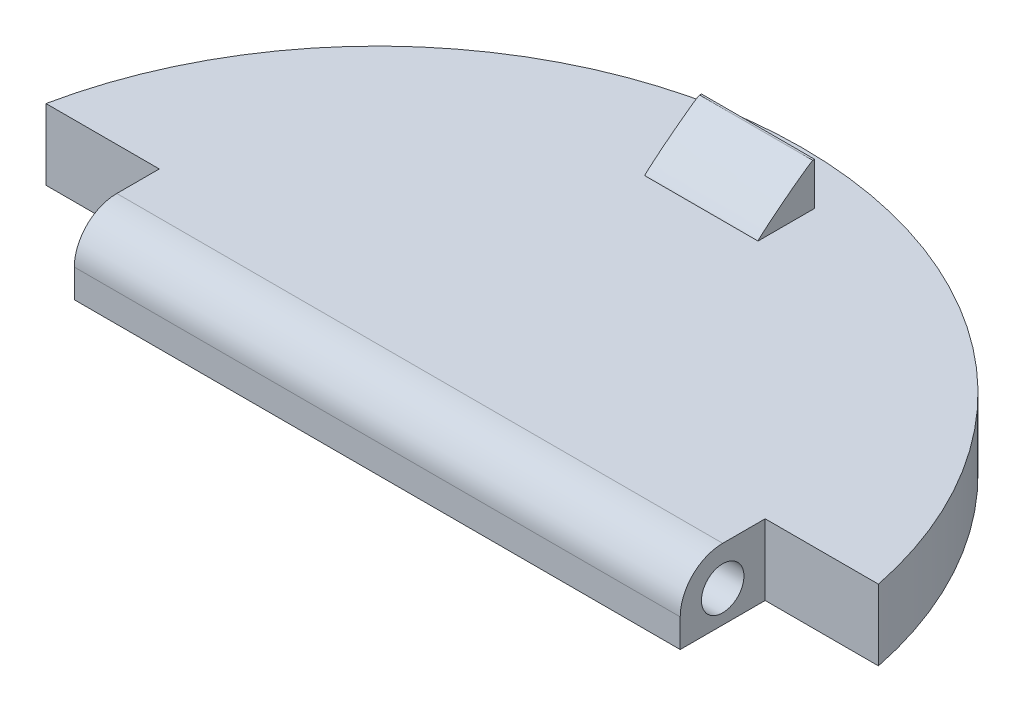
ISO-10303-21;
HEADER;
FILE_DESCRIPTION(('STEP AP214'),'2;1');
FILE_NAME('part.step','',(''),(''),'','','');
FILE_SCHEMA(('AUTOMOTIVE_DESIGN { 1 0 10303 214 1 1 1 1 }'));
ENDSEC;
DATA;
#1=APPLICATION_CONTEXT('core data for automotive mechanical design processes');
#2=APPLICATION_PROTOCOL_DEFINITION('international standard','automotive_design',2000,#1);
#3=PRODUCT_CONTEXT('',#1,'mechanical');
#4=PRODUCT('Part','Part','',(#3));
#5=PRODUCT_RELATED_PRODUCT_CATEGORY('part','',(#4));
#6=PRODUCT_DEFINITION_FORMATION('','',#4);
#7=PRODUCT_DEFINITION_CONTEXT('part definition',#1,'design');
#8=PRODUCT_DEFINITION('design','',#6,#7);
#9=PRODUCT_DEFINITION_SHAPE('','',#8);
#10=(LENGTH_UNIT() NAMED_UNIT(*) SI_UNIT(.MILLI.,.METRE.));
#11=(NAMED_UNIT(*) PLANE_ANGLE_UNIT() SI_UNIT($,.RADIAN.));
#12=(NAMED_UNIT(*) SI_UNIT($,.STERADIAN.) SOLID_ANGLE_UNIT());
#13=UNCERTAINTY_MEASURE_WITH_UNIT(LENGTH_MEASURE(1.E-05),#10,'distance_accuracy_value','');
#14=(GEOMETRIC_REPRESENTATION_CONTEXT(3) GLOBAL_UNCERTAINTY_ASSIGNED_CONTEXT((#13)) GLOBAL_UNIT_ASSIGNED_CONTEXT((#10,
#11,#12)) REPRESENTATION_CONTEXT('',''));
#15=CARTESIAN_POINT('',(0.,0.,0.));
#16=DIRECTION('',(0.,0.,1.));
#17=DIRECTION('',(1.,0.,0.));
#18=AXIS2_PLACEMENT_3D('',#15,#16,#17);
#19=CARTESIAN_POINT('',(0.,5.,0.));
#20=DIRECTION('',(0.,1.,0.));
#21=DIRECTION('',(0.,0.,1.));
#22=AXIS2_PLACEMENT_3D('',#19,#20,#21);
#23=PLANE('',#22);
#24=DIRECTION('',(0.,0.,-1.));
#25=VECTOR('',#24,1.);
#26=CARTESIAN_POINT('',(-21.3938769133982,5.,0.));
#27=LINE('',#26,#25);
#28=CARTESIAN_POINT('',(-21.3938769133982,5.,-3.));
#29=VERTEX_POINT('',#28);
#30=CARTESIAN_POINT('',(-21.3938769133982,5.,-6.));
#31=VERTEX_POINT('',#30);
#32=EDGE_CURVE('E125',#29,#31,#27,.T.);
#33=ORIENTED_EDGE('',*,*,#32,.F.);
#34=DIRECTION('',(1.,0.,0.));
#35=VECTOR('',#34,1.);
#36=CARTESIAN_POINT('',(21.3938769133982,5.,-3.));
#37=LINE('',#36,#35);
#38=CARTESIAN_POINT('',(21.3938769133982,5.,-3.));
#39=VERTEX_POINT('',#38);
#40=EDGE_CURVE('E241',#29,#39,#37,.T.);
#41=ORIENTED_EDGE('',*,*,#40,.T.);
#42=DIRECTION('',(0.,0.,1.));
#43=VECTOR('',#42,1.);
#44=CARTESIAN_POINT('',(21.3938769133982,5.,0.));
#45=LINE('',#44,#43);
#46=CARTESIAN_POINT('',(21.3938769133982,5.,-6.));
#47=VERTEX_POINT('',#46);
#48=EDGE_CURVE('E167',#47,#39,#45,.T.);
#49=ORIENTED_EDGE('',*,*,#48,.F.);
#50=DIRECTION('',(-1.,0.,0.));
#51=VECTOR('',#50,1.);
#52=CARTESIAN_POINT('',(21.3938769133982,5.,-6.));
#53=LINE('',#52,#51);
#54=CARTESIAN_POINT('',(29.3938769133982,5.,-6.));
#55=VERTEX_POINT('',#54);
#56=EDGE_CURVE('E163',#55,#47,#53,.T.);
#57=ORIENTED_EDGE('',*,*,#56,.F.);
#58=CARTESIAN_POINT('',(0.,5.,0.));
#59=DIRECTION('',(0.,1.,0.));
#60=DIRECTION('',(0.,0.,1.));
#61=AXIS2_PLACEMENT_3D('',#58,#59,#60);
#62=CIRCLE('',#61,30.);
#63=CARTESIAN_POINT('',(-29.3938769133982,5.,-6.));
#64=VERTEX_POINT('',#63);
#65=EDGE_CURVE('E153',#55,#64,#62,.T.);
#66=ORIENTED_EDGE('',*,*,#65,.T.);
#67=DIRECTION('',(-1.,0.,0.));
#68=VECTOR('',#67,1.);
#69=CARTESIAN_POINT('',(-21.3938769133982,5.,-6.));
#70=LINE('',#69,#68);
#71=EDGE_CURVE('E136',#31,#64,#70,.T.);
#72=ORIENTED_EDGE('',*,*,#71,.F.);
#73=EDGE_LOOP('',(#33,#41,#49,#57,#66,#72));
#74=FACE_BOUND('',#73,.T.);
#75=DIRECTION('',(-1.,0.,0.));
#76=VECTOR('',#75,1.);
#77=CARTESIAN_POINT('',(-3.84159331598207,5.,-26.7316665793187));
#78=LINE('',#77,#76);
#79=CARTESIAN_POINT('',(4.15840668401793,5.,-26.7316665793187));
#80=VERTEX_POINT('',#79);
#81=CARTESIAN_POINT('',(-3.84159331598207,5.,-26.7316665793187));
#82=VERTEX_POINT('',#81);
#83=EDGE_CURVE('E200',#80,#82,#78,.T.);
#84=ORIENTED_EDGE('',*,*,#83,.F.);
#85=DIRECTION('',(0.,0.,-1.));
#86=VECTOR('',#85,1.);
#87=CARTESIAN_POINT('',(4.15840668401793,5.,-26.7316665793187));
#88=LINE('',#87,#86);
#89=CARTESIAN_POINT('',(4.15840668401793,5.,-22.7316665793187));
#90=VERTEX_POINT('',#89);
#91=EDGE_CURVE('E161',#90,#80,#88,.T.);
#92=ORIENTED_EDGE('',*,*,#91,.F.);
#93=CARTESIAN_POINT('',(-4.24159331598207,5.,-22.7316665793187));
#94=CARTESIAN_POINT('',(-1.30825998264874,5.,-22.7316665793187));
#95=CARTESIAN_POINT('',(1.6250733506846,5.,-22.7316665793187));
#96=CARTESIAN_POINT('',(4.55840668401793,5.,-22.7316665793187));
#97=(BOUNDED_CURVE() B_SPLINE_CURVE(3,(#93,#94,#95,#96),.UNSPECIFIED.,.F.,
.F.) B_SPLINE_CURVE_WITH_KNOTS((4,4),(-0.00455840668401793,0.00424159331598207),
.UNSPECIFIED.) CURVE() GEOMETRIC_REPRESENTATION_ITEM() RATIONAL_B_SPLINE_CURVE((1.,1.,1.,1.)) REPRESENTATION_ITEM(''));
#98=CARTESIAN_POINT('',(-3.84159331598207,5.,-22.7316665793187));
#99=VERTEX_POINT('',#98);
#100=EDGE_CURVE('E188',#99,#90,#97,.T.);
#101=ORIENTED_EDGE('',*,*,#100,.F.);
#102=DIRECTION('',(0.,0.,1.));
#103=VECTOR('',#102,1.);
#104=CARTESIAN_POINT('',(-3.84159331598207,5.,-26.7316665793187));
#105=LINE('',#104,#103);
#106=EDGE_CURVE('E203',#82,#99,#105,.T.);
#107=ORIENTED_EDGE('',*,*,#106,.F.);
#108=EDGE_LOOP('',(#84,#92,#101,#107));
#109=FACE_BOUND('',#108,.T.);
#110=ADVANCED_FACE('F44',(#74,#109),#23,.T.);
#111=CARTESIAN_POINT('',(0.,5.,0.));
#112=DIRECTION('',(0.,-1.,0.));
#113=DIRECTION('',(0.,0.,-1.));
#114=AXIS2_PLACEMENT_3D('',#111,#112,#113);
#115=CYLINDRICAL_SURFACE('',#114,30.);
#116=CARTESIAN_POINT('',(0.,0.,0.));
#117=DIRECTION('',(0.,1.,0.));
#118=DIRECTION('',(0.,0.,1.));
#119=AXIS2_PLACEMENT_3D('',#116,#117,#118);
#120=CIRCLE('',#119,30.);
#121=CARTESIAN_POINT('',(29.3938769133982,0.,-6.));
#122=VERTEX_POINT('',#121);
#123=CARTESIAN_POINT('',(-29.3938769133982,0.,-6.));
#124=VERTEX_POINT('',#123);
#125=EDGE_CURVE('E210',#122,#124,#120,.T.);
#126=ORIENTED_EDGE('',*,*,#125,.T.);
#127=DIRECTION('',(0.,1.,0.));
#128=VECTOR('',#127,1.);
#129=CARTESIAN_POINT('',(-29.3938769133982,-5.,-6.));
#130=LINE('',#129,#128);
#131=EDGE_CURVE('E146',#124,#64,#130,.T.);
#132=ORIENTED_EDGE('',*,*,#131,.T.);
#133=ORIENTED_EDGE('',*,*,#65,.F.);
#134=DIRECTION('',(0.,1.,0.));
#135=VECTOR('',#134,1.);
#136=CARTESIAN_POINT('',(29.3938769133982,-5.,-6.));
#137=LINE('',#136,#135);
#138=EDGE_CURVE('E171',#122,#55,#137,.T.);
#139=ORIENTED_EDGE('',*,*,#138,.F.);
#140=EDGE_LOOP('',(#126,#132,#133,#139));
#141=FACE_BOUND('',#140,.T.);
#142=ADVANCED_FACE('F251',(#141),#115,.T.);
#143=CARTESIAN_POINT('',(-30.,5.,0.));
#144=DIRECTION('',(0.,0.,-1.));
#145=DIRECTION('',(-1.,0.,0.));
#146=AXIS2_PLACEMENT_3D('',#143,#144,#145);
#147=PLANE('',#146);
#148=DIRECTION('',(0.,1.,0.));
#149=VECTOR('',#148,1.);
#150=CARTESIAN_POINT('',(21.3938769133982,-5.,0.));
#151=LINE('',#150,#149);
#152=CARTESIAN_POINT('',(21.3938769133982,0.,0.));
#153=VERTEX_POINT('',#152);
#154=CARTESIAN_POINT('',(21.3938769133982,2.,0.));
#155=VERTEX_POINT('',#154);
#156=EDGE_CURVE('E137',#153,#155,#151,.T.);
#157=ORIENTED_EDGE('',*,*,#156,.T.);
#158=DIRECTION('',(1.,0.,0.));
#159=VECTOR('',#158,1.);
#160=CARTESIAN_POINT('',(-21.3938769133982,2.,0.));
#161=LINE('',#160,#159);
#162=CARTESIAN_POINT('',(-21.3938769133982,2.,0.));
#163=VERTEX_POINT('',#162);
#164=EDGE_CURVE('E52',#155,#163,#161,.F.);
#165=ORIENTED_EDGE('',*,*,#164,.T.);
#166=DIRECTION('',(0.,1.,0.));
#167=VECTOR('',#166,1.);
#168=CARTESIAN_POINT('',(-21.3938769133982,-5.,0.));
#169=LINE('',#168,#167);
#170=CARTESIAN_POINT('',(-21.3938769133982,0.,0.));
#171=VERTEX_POINT('',#170);
#172=EDGE_CURVE('E147',#171,#163,#169,.T.);
#173=ORIENTED_EDGE('',*,*,#172,.F.);
#174=DIRECTION('',(1.,0.,0.));
#175=VECTOR('',#174,1.);
#176=CARTESIAN_POINT('',(-30.,0.,0.));
#177=LINE('',#176,#175);
#178=EDGE_CURVE('E189',#171,#153,#177,.T.);
#179=ORIENTED_EDGE('',*,*,#178,.T.);
#180=EDGE_LOOP('',(#157,#165,#173,#179));
#181=FACE_BOUND('',#180,.T.);
#182=ADVANCED_FACE('F221',(#181),#147,.F.);
#183=CARTESIAN_POINT('',(0.,0.,0.));
#184=DIRECTION('',(0.,1.,0.));
#185=DIRECTION('',(0.,0.,1.));
#186=AXIS2_PLACEMENT_3D('',#183,#184,#185);
#187=PLANE('',#186);
#188=DIRECTION('',(0.,0.,-1.));
#189=VECTOR('',#188,1.);
#190=CARTESIAN_POINT('',(-21.3938769133982,0.,0.));
#191=LINE('',#190,#189);
#192=CARTESIAN_POINT('',(-21.3938769133982,0.,-6.));
#193=VERTEX_POINT('',#192);
#194=EDGE_CURVE('E225',#171,#193,#191,.T.);
#195=ORIENTED_EDGE('',*,*,#194,.T.);
#196=DIRECTION('',(-1.,0.,0.));
#197=VECTOR('',#196,1.);
#198=CARTESIAN_POINT('',(0.,0.,-6.));
#199=LINE('',#198,#197);
#200=EDGE_CURVE('E143',#193,#124,#199,.T.);
#201=ORIENTED_EDGE('',*,*,#200,.T.);
#202=ORIENTED_EDGE('',*,*,#125,.F.);
#203=DIRECTION('',(-1.,0.,0.));
#204=VECTOR('',#203,1.);
#205=CARTESIAN_POINT('',(0.,0.,-6.));
#206=LINE('',#205,#204);
#207=CARTESIAN_POINT('',(21.3938769133982,0.,-6.));
#208=VERTEX_POINT('',#207);
#209=EDGE_CURVE('E229',#122,#208,#206,.T.);
#210=ORIENTED_EDGE('',*,*,#209,.T.);
#211=DIRECTION('',(0.,0.,1.));
#212=VECTOR('',#211,1.);
#213=CARTESIAN_POINT('',(21.3938769133982,0.,0.));
#214=LINE('',#213,#212);
#215=EDGE_CURVE('E228',#208,#153,#214,.T.);
#216=ORIENTED_EDGE('',*,*,#215,.T.);
#217=ORIENTED_EDGE('',*,*,#178,.F.);
#218=EDGE_LOOP('',(#195,#201,#202,#210,#216,#217));
#219=FACE_BOUND('',#218,.T.);
#220=ADVANCED_FACE('F224',(#219),#187,.F.);
#221=CARTESIAN_POINT('',(4.15840668401793,8.,-26.7316665793187));
#222=DIRECTION('',(-1.,0.,0.));
#223=DIRECTION('',(0.,0.,1.));
#224=AXIS2_PLACEMENT_3D('',#221,#222,#223);
#225=PLANE('',#224);
#226=DIRECTION('',(0.,0.,-1.));
#227=VECTOR('',#226,1.);
#228=CARTESIAN_POINT('',(4.15840668401793,8.,-26.7316665793187));
#229=LINE('',#228,#227);
#230=CARTESIAN_POINT('',(4.15840668401793,8.,-26.6046499255261));
#231=VERTEX_POINT('',#230);
#232=CARTESIAN_POINT('',(4.15840668401793,8.,-26.7316665793187));
#233=VERTEX_POINT('',#232);
#234=EDGE_CURVE('E184',#231,#233,#229,.T.);
#235=ORIENTED_EDGE('',*,*,#234,.F.);
#236=CARTESIAN_POINT('',(4.15840668401793,5.,-22.7316665793187));
#237=CARTESIAN_POINT('',(4.15840668401793,8.,-23.5062632485602));
#238=CARTESIAN_POINT('',(4.15840668401793,8.,-26.6046499255261));
#239=(BOUNDED_CURVE() B_SPLINE_CURVE(2,(#236,#237,#238),.UNSPECIFIED.,.F.,
.F.) B_SPLINE_CURVE_WITH_KNOTS((3,3),(0.,1.),
.UNSPECIFIED.) CURVE() GEOMETRIC_REPRESENTATION_ITEM() RATIONAL_B_SPLINE_CURVE((1.,
0.0574959574576069,1.)) REPRESENTATION_ITEM(''));
#240=EDGE_CURVE('E350',#231,#90,#239,.F.);
#241=ORIENTED_EDGE('',*,*,#240,.T.);
#242=ORIENTED_EDGE('',*,*,#91,.T.);
#243=DIRECTION('',(0.,-1.,0.));
#244=VECTOR('',#243,1.);
#245=CARTESIAN_POINT('',(4.15840668401793,8.,-26.7316665793187));
#246=LINE('',#245,#244);
#247=EDGE_CURVE('E207',#233,#80,#246,.T.);
#248=ORIENTED_EDGE('',*,*,#247,.F.);
#249=EDGE_LOOP('',(#235,#241,#242,#248));
#250=FACE_BOUND('',#249,.T.);
#251=ADVANCED_FACE('F333',(#250),#225,.F.);
#252=CARTESIAN_POINT('',(-3.84159331598207,8.,-26.7316665793187));
#253=DIRECTION('',(0.,0.,1.));
#254=DIRECTION('',(1.,0.,0.));
#255=AXIS2_PLACEMENT_3D('',#252,#253,#254);
#256=PLANE('',#255);
#257=ORIENTED_EDGE('',*,*,#83,.T.);
#258=DIRECTION('',(0.,-1.,0.));
#259=VECTOR('',#258,1.);
#260=CARTESIAN_POINT('',(-3.84159331598207,8.,-26.7316665793187));
#261=LINE('',#260,#259);
#262=CARTESIAN_POINT('',(-3.84159331598207,8.,-26.7316665793187));
#263=VERTEX_POINT('',#262);
#264=EDGE_CURVE('E195',#263,#82,#261,.T.);
#265=ORIENTED_EDGE('',*,*,#264,.F.);
#266=DIRECTION('',(-1.,0.,0.));
#267=VECTOR('',#266,1.);
#268=CARTESIAN_POINT('',(-3.84159331598207,8.,-26.7316665793187));
#269=LINE('',#268,#267);
#270=EDGE_CURVE('E181',#233,#263,#269,.T.);
#271=ORIENTED_EDGE('',*,*,#270,.F.);
#272=ORIENTED_EDGE('',*,*,#247,.T.);
#273=EDGE_LOOP('',(#257,#265,#271,#272));
#274=FACE_BOUND('',#273,.T.);
#275=ADVANCED_FACE('F340',(#274),#256,.F.);
#276=CARTESIAN_POINT('',(-3.84159331598207,8.,-26.7316665793187));
#277=DIRECTION('',(1.,0.,0.));
#278=DIRECTION('',(0.,0.,-1.));
#279=AXIS2_PLACEMENT_3D('',#276,#277,#278);
#280=PLANE('',#279);
#281=ORIENTED_EDGE('',*,*,#106,.T.);
#282=CARTESIAN_POINT('',(-3.84159331598207,8.,-26.6046499255261));
#283=CARTESIAN_POINT('',(-3.84159331598207,8.,-23.5062632485602));
#284=CARTESIAN_POINT('',(-3.84159331598207,5.,-22.7316665793187));
#285=(BOUNDED_CURVE() B_SPLINE_CURVE(2,(#282,#283,#284),.UNSPECIFIED.,.F.,
.F.) B_SPLINE_CURVE_WITH_KNOTS((3,3),(0.,1.),
.UNSPECIFIED.) CURVE() GEOMETRIC_REPRESENTATION_ITEM() RATIONAL_B_SPLINE_CURVE((1.,
0.0574959574576069,1.)) REPRESENTATION_ITEM(''));
#286=CARTESIAN_POINT('',(-3.84159331598207,8.,-26.6046499255261));
#287=VERTEX_POINT('',#286);
#288=EDGE_CURVE('E235',#99,#287,#285,.F.);
#289=ORIENTED_EDGE('',*,*,#288,.T.);
#290=DIRECTION('',(0.,0.,1.));
#291=VECTOR('',#290,1.);
#292=CARTESIAN_POINT('',(-3.84159331598207,8.,-26.7316665793187));
#293=LINE('',#292,#291);
#294=EDGE_CURVE('E191',#263,#287,#293,.T.);
#295=ORIENTED_EDGE('',*,*,#294,.F.);
#296=ORIENTED_EDGE('',*,*,#264,.T.);
#297=EDGE_LOOP('',(#281,#289,#295,#296));
#298=FACE_BOUND('',#297,.T.);
#299=ADVANCED_FACE('F345',(#298),#280,.F.);
#300=CARTESIAN_POINT('',(0.,8.,0.));
#301=DIRECTION('',(0.,1.,0.));
#302=DIRECTION('',(0.,0.,1.));
#303=AXIS2_PLACEMENT_3D('',#300,#301,#302);
#304=PLANE('',#303);
#305=ORIENTED_EDGE('',*,*,#294,.T.);
#306=CARTESIAN_POINT('',(4.55840668401793,8.,-26.6046499255261));
#307=CARTESIAN_POINT('',(1.6250733506846,8.,-26.6046499255261));
#308=CARTESIAN_POINT('',(-1.30825998264874,8.,-26.6046499255261));
#309=CARTESIAN_POINT('',(-4.24159331598207,8.,-26.6046499255261));
#310=(BOUNDED_CURVE() B_SPLINE_CURVE(3,(#306,#307,#308,#309),.UNSPECIFIED.,.F.,
.F.) B_SPLINE_CURVE_WITH_KNOTS((4,4),(-0.00455840668401793,0.00424159331598207),
.UNSPECIFIED.) CURVE() GEOMETRIC_REPRESENTATION_ITEM() RATIONAL_B_SPLINE_CURVE((1.,1.,1.,1.)) REPRESENTATION_ITEM(''));
#311=EDGE_CURVE('E212',#287,#231,#310,.F.);
#312=ORIENTED_EDGE('',*,*,#311,.T.);
#313=ORIENTED_EDGE('',*,*,#234,.T.);
#314=ORIENTED_EDGE('',*,*,#270,.T.);
#315=EDGE_LOOP('',(#305,#312,#313,#314));
#316=FACE_BOUND('',#315,.T.);
#317=ADVANCED_FACE('F271',(#316),#304,.T.);
#318=CARTESIAN_POINT('',(4.55840668401793,5.,-22.7316665793187));
#319=CARTESIAN_POINT('',(1.6250733506846,5.,-22.7316665793187));
#320=CARTESIAN_POINT('',(-1.30825998264874,5.,-22.7316665793187));
#321=CARTESIAN_POINT('',(-4.24159331598207,5.,-22.7316665793187));
#322=CARTESIAN_POINT('',(4.55840668401793,8.,-23.5062632485602));
#323=CARTESIAN_POINT('',(1.6250733506846,8.,-23.5062632485602));
#324=CARTESIAN_POINT('',(-1.30825998264874,8.,-23.5062632485602));
#325=CARTESIAN_POINT('',(-4.24159331598207,8.,-23.5062632485602));
#326=CARTESIAN_POINT('',(4.55840668401793,8.,-26.6046499255261));
#327=CARTESIAN_POINT('',(1.6250733506846,8.,-26.6046499255261));
#328=CARTESIAN_POINT('',(-1.30825998264874,8.,-26.6046499255261));
#329=CARTESIAN_POINT('',(-4.24159331598207,8.,-26.6046499255261));
#330=(BOUNDED_SURFACE() B_SPLINE_SURFACE(2,3,((#318,#319,#320,#321),(#322,#323,#324,#325),(#326,
#327,#328,#329)),.UNSPECIFIED.,.F.,.F.,.F.) B_SPLINE_SURFACE_WITH_KNOTS((3,3),(4,4),(0.,1.),
(-0.00455840668401793,0.00424159331598207),
.UNSPECIFIED.) GEOMETRIC_REPRESENTATION_ITEM() RATIONAL_B_SPLINE_SURFACE(((1.,1.,1.,1.),
(0.0574959574576069,0.0574959574576069,0.0574959574576069,0.0574959574576069),(1.,1.,1.,1.))) REPRESENTATION_ITEM('') SURFACE());
#331=ORIENTED_EDGE('',*,*,#288,.F.);
#332=ORIENTED_EDGE('',*,*,#100,.T.);
#333=ORIENTED_EDGE('',*,*,#240,.F.);
#334=ORIENTED_EDGE('',*,*,#311,.F.);
#335=EDGE_LOOP('',(#331,#332,#333,#334));
#336=FACE_BOUND('',#335,.T.);
#337=ADVANCED_FACE('F264',(#336),#330,.T.);
#338=CARTESIAN_POINT('',(21.3938769133982,-5.,0.));
#339=DIRECTION('',(-1.,0.,0.));
#340=DIRECTION('',(0.,0.,1.));
#341=AXIS2_PLACEMENT_3D('',#338,#339,#340);
#342=PLANE('',#341);
#343=CARTESIAN_POINT('',(21.3938769133982,2.25,-3.));
#344=DIRECTION('',(1.,0.,0.));
#345=DIRECTION('',(0.,0.,-1.));
#346=AXIS2_PLACEMENT_3D('',#343,#344,#345);
#347=CIRCLE('',#346,1.5);
#348=CARTESIAN_POINT('',(21.3938769133982,2.25,-4.5));
#349=VERTEX_POINT('',#348);
#350=EDGE_CURVE('E425',#349,#349,#347,.T.);
#351=ORIENTED_EDGE('',*,*,#350,.F.);
#352=EDGE_LOOP('',(#351));
#353=FACE_BOUND('',#352,.T.);
#354=ORIENTED_EDGE('',*,*,#48,.T.);
#355=CARTESIAN_POINT('',(21.3938769133982,2.,-3.));
#356=DIRECTION('',(-1.,0.,0.));
#357=DIRECTION('',(0.,0.,1.));
#358=AXIS2_PLACEMENT_3D('',#355,#356,#357);
#359=CIRCLE('',#358,3.);
#360=EDGE_CURVE('E66',#39,#155,#359,.F.);
#361=ORIENTED_EDGE('',*,*,#360,.T.);
#362=ORIENTED_EDGE('',*,*,#156,.F.);
#363=ORIENTED_EDGE('',*,*,#215,.F.);
#364=DIRECTION('',(0.,1.,0.));
#365=VECTOR('',#364,1.);
#366=CARTESIAN_POINT('',(21.3938769133982,-5.,-6.));
#367=LINE('',#366,#365);
#368=EDGE_CURVE('E174',#208,#47,#367,.T.);
#369=ORIENTED_EDGE('',*,*,#368,.T.);
#370=EDGE_LOOP('',(#354,#361,#362,#363,#369));
#371=FACE_BOUND('',#370,.T.);
#372=ADVANCED_FACE('F248',(#353,#371),#342,.F.);
#373=CARTESIAN_POINT('',(21.3938769133982,-5.,-6.));
#374=DIRECTION('',(0.,0.,-1.));
#375=DIRECTION('',(-1.,0.,0.));
#376=AXIS2_PLACEMENT_3D('',#373,#374,#375);
#377=PLANE('',#376);
#378=ORIENTED_EDGE('',*,*,#138,.T.);
#379=ORIENTED_EDGE('',*,*,#56,.T.);
#380=ORIENTED_EDGE('',*,*,#368,.F.);
#381=ORIENTED_EDGE('',*,*,#209,.F.);
#382=EDGE_LOOP('',(#378,#379,#380,#381));
#383=FACE_BOUND('',#382,.T.);
#384=ADVANCED_FACE('F250',(#383),#377,.F.);
#385=CARTESIAN_POINT('',(-21.3938769133982,-5.,-6.));
#386=DIRECTION('',(0.,0.,-1.));
#387=DIRECTION('',(-1.,0.,0.));
#388=AXIS2_PLACEMENT_3D('',#385,#386,#387);
#389=PLANE('',#388);
#390=DIRECTION('',(0.,1.,0.));
#391=VECTOR('',#390,1.);
#392=CARTESIAN_POINT('',(-21.3938769133982,-5.,-6.));
#393=LINE('',#392,#391);
#394=EDGE_CURVE('E128',#193,#31,#393,.T.);
#395=ORIENTED_EDGE('',*,*,#394,.T.);
#396=ORIENTED_EDGE('',*,*,#71,.T.);
#397=ORIENTED_EDGE('',*,*,#131,.F.);
#398=ORIENTED_EDGE('',*,*,#200,.F.);
#399=EDGE_LOOP('',(#395,#396,#397,#398));
#400=FACE_BOUND('',#399,.T.);
#401=ADVANCED_FACE('F140',(#400),#389,.F.);
#402=CARTESIAN_POINT('',(-21.3938769133982,-5.,0.));
#403=DIRECTION('',(1.,0.,0.));
#404=DIRECTION('',(0.,0.,-1.));
#405=AXIS2_PLACEMENT_3D('',#402,#403,#404);
#406=PLANE('',#405);
#407=CARTESIAN_POINT('',(-21.3938769133982,2.25,-3.));
#408=DIRECTION('',(-1.,0.,0.));
#409=DIRECTION('',(0.,0.,1.));
#410=AXIS2_PLACEMENT_3D('',#407,#408,#409);
#411=CIRCLE('',#410,1.25);
#412=CARTESIAN_POINT('',(-21.3938769133982,2.25,-1.75));
#413=VERTEX_POINT('',#412);
#414=EDGE_CURVE('E426',#413,#413,#411,.T.);
#415=ORIENTED_EDGE('',*,*,#414,.F.);
#416=EDGE_LOOP('',(#415));
#417=FACE_BOUND('',#416,.T.);
#418=ORIENTED_EDGE('',*,*,#172,.T.);
#419=CARTESIAN_POINT('',(-21.3938769133982,2.,-3.));
#420=DIRECTION('',(1.,0.,0.));
#421=DIRECTION('',(0.,0.,-1.));
#422=AXIS2_PLACEMENT_3D('',#419,#420,#421);
#423=CIRCLE('',#422,3.);
#424=EDGE_CURVE('E12',#163,#29,#423,.F.);
#425=ORIENTED_EDGE('',*,*,#424,.T.);
#426=ORIENTED_EDGE('',*,*,#32,.T.);
#427=ORIENTED_EDGE('',*,*,#394,.F.);
#428=ORIENTED_EDGE('',*,*,#194,.F.);
#429=EDGE_LOOP('',(#418,#425,#426,#427,#428));
#430=FACE_BOUND('',#429,.T.);
#431=ADVANCED_FACE('F127',(#417,#430),#406,.F.);
#432=CARTESIAN_POINT('',(0.,2.,-3.));
#433=DIRECTION('',(-1.,0.,0.));
#434=DIRECTION('',(0.,0.,1.));
#435=AXIS2_PLACEMENT_3D('',#432,#433,#434);
#436=CYLINDRICAL_SURFACE('',#435,3.);
#437=ORIENTED_EDGE('',*,*,#424,.F.);
#438=ORIENTED_EDGE('',*,*,#164,.F.);
#439=ORIENTED_EDGE('',*,*,#360,.F.);
#440=ORIENTED_EDGE('',*,*,#40,.F.);
#441=EDGE_LOOP('',(#437,#438,#439,#440));
#442=FACE_BOUND('',#441,.T.);
#443=ADVANCED_FACE('F46',(#442),#436,.T.);
#444=CARTESIAN_POINT('',(16.3938769133982,2.25,-3.));
#445=DIRECTION('',(1.,0.,0.));
#446=DIRECTION('',(0.,0.,-1.));
#447=AXIS2_PLACEMENT_3D('',#444,#445,#446);
#448=CYLINDRICAL_SURFACE('',#447,1.5);
#449=CARTESIAN_POINT('',(16.3938769133982,2.25,-3.));
#450=DIRECTION('',(1.,0.,0.));
#451=DIRECTION('',(0.,0.,-1.));
#452=AXIS2_PLACEMENT_3D('',#449,#450,#451);
#453=CIRCLE('',#452,1.5);
#454=CARTESIAN_POINT('',(16.3938769133982,2.25,-4.5));
#455=VERTEX_POINT('',#454);
#456=EDGE_CURVE('E168',#455,#455,#453,.T.);
#457=ORIENTED_EDGE('',*,*,#456,.F.);
#458=EDGE_LOOP('',(#457));
#459=FACE_BOUND('',#458,.T.);
#460=ORIENTED_EDGE('',*,*,#350,.T.);
#461=EDGE_LOOP('',(#460));
#462=FACE_BOUND('',#461,.T.);
#463=ADVANCED_FACE('F404',(#459,#462),#448,.F.);
#464=CARTESIAN_POINT('',(16.3938769133982,2.25,-3.));
#465=DIRECTION('',(1.,0.,0.));
#466=DIRECTION('',(0.,0.,-1.));
#467=AXIS2_PLACEMENT_3D('',#464,#465,#466);
#468=PLANE('',#467);
#469=ORIENTED_EDGE('',*,*,#456,.T.);
#470=EDGE_LOOP('',(#469));
#471=FACE_BOUND('',#470,.T.);
#472=ADVANCED_FACE('F407',(#471),#468,.T.);
#473=CARTESIAN_POINT('',(-16.3938769133982,2.25,-3.));
#474=DIRECTION('',(-1.,0.,0.));
#475=DIRECTION('',(0.,0.,1.));
#476=AXIS2_PLACEMENT_3D('',#473,#474,#475);
#477=CYLINDRICAL_SURFACE('',#476,1.25);
#478=CARTESIAN_POINT('',(-16.3938769133982,2.25,-3.));
#479=DIRECTION('',(-1.,0.,0.));
#480=DIRECTION('',(0.,0.,1.));
#481=AXIS2_PLACEMENT_3D('',#478,#479,#480);
#482=CIRCLE('',#481,1.25);
#483=CARTESIAN_POINT('',(-16.3938769133982,2.25,-1.75));
#484=VERTEX_POINT('',#483);
#485=EDGE_CURVE('E423',#484,#484,#482,.T.);
#486=ORIENTED_EDGE('',*,*,#485,.F.);
#487=EDGE_LOOP('',(#486));
#488=FACE_BOUND('',#487,.T.);
#489=ORIENTED_EDGE('',*,*,#414,.T.);
#490=EDGE_LOOP('',(#489));
#491=FACE_BOUND('',#490,.T.);
#492=ADVANCED_FACE('F411',(#488,#491),#477,.F.);
#493=CARTESIAN_POINT('',(-16.3938769133982,2.25,-3.));
#494=DIRECTION('',(-1.,0.,0.));
#495=DIRECTION('',(0.,0.,1.));
#496=AXIS2_PLACEMENT_3D('',#493,#494,#495);
#497=PLANE('',#496);
#498=ORIENTED_EDGE('',*,*,#485,.T.);
#499=EDGE_LOOP('',(#498));
#500=FACE_BOUND('',#499,.T.);
#501=ADVANCED_FACE('F415',(#500),#497,.T.);
#502=CLOSED_SHELL('',(#110,#142,#182,#220,#251,#275,#299,#317,#337,#372,#384,#401,#431,#443,
#463,#472,#492,#501));
#503=MANIFOLD_SOLID_BREP('B2',#502);
#504=ADVANCED_BREP_SHAPE_REPRESENTATION('',(#18,#503),#14);
#505=SHAPE_DEFINITION_REPRESENTATION(#9,#504);
ENDSEC;
END-ISO-10303-21;
